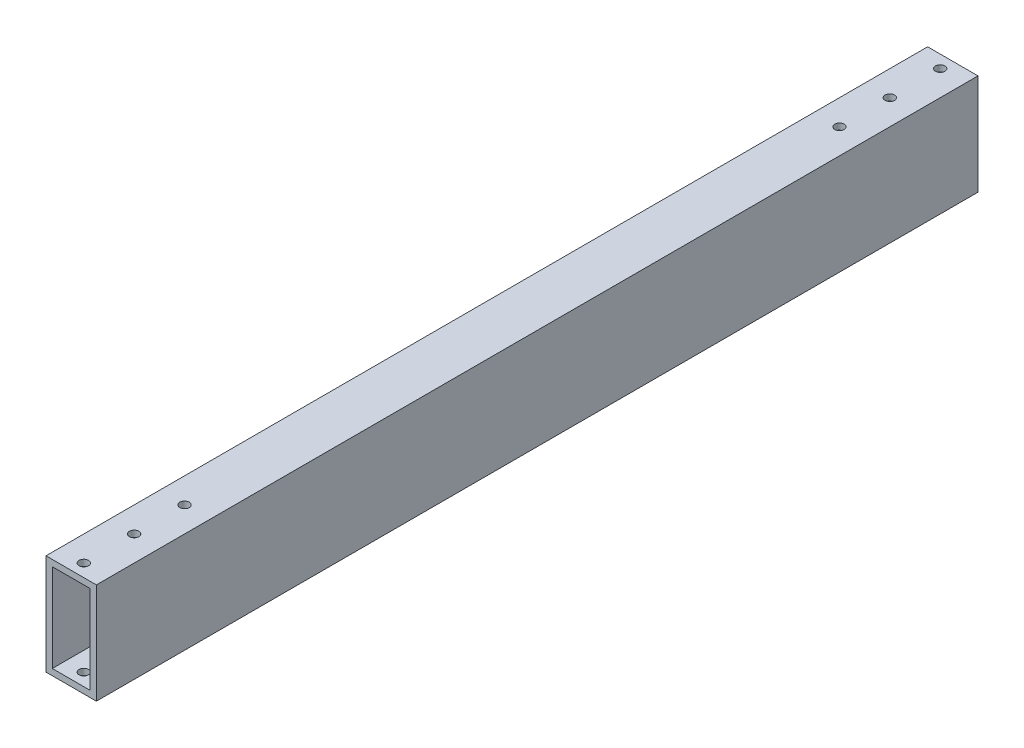
ISO-10303-21;
HEADER;
FILE_DESCRIPTION(('STEP AP214'),'2;1');
FILE_NAME('part.step','',(''),(''),'','','');
FILE_SCHEMA(('AUTOMOTIVE_DESIGN { 1 0 10303 214 1 1 1 1 }'));
ENDSEC;
DATA;
#1=APPLICATION_CONTEXT('core data for automotive mechanical design processes');
#2=APPLICATION_PROTOCOL_DEFINITION('international standard','automotive_design',2000,#1);
#3=PRODUCT_CONTEXT('',#1,'mechanical');
#4=PRODUCT('Part','Part','',(#3));
#5=PRODUCT_RELATED_PRODUCT_CATEGORY('part','',(#4));
#6=PRODUCT_DEFINITION_FORMATION('','',#4);
#7=PRODUCT_DEFINITION_CONTEXT('part definition',#1,'design');
#8=PRODUCT_DEFINITION('design','',#6,#7);
#9=PRODUCT_DEFINITION_SHAPE('','',#8);
#10=(LENGTH_UNIT() NAMED_UNIT(*) SI_UNIT(.MILLI.,.METRE.));
#11=(NAMED_UNIT(*) PLANE_ANGLE_UNIT() SI_UNIT($,.RADIAN.));
#12=(NAMED_UNIT(*) SI_UNIT($,.STERADIAN.) SOLID_ANGLE_UNIT());
#13=UNCERTAINTY_MEASURE_WITH_UNIT(LENGTH_MEASURE(1.E-05),#10,'distance_accuracy_value','');
#14=(GEOMETRIC_REPRESENTATION_CONTEXT(3) GLOBAL_UNCERTAINTY_ASSIGNED_CONTEXT((#13)) GLOBAL_UNIT_ASSIGNED_CONTEXT((#10,
#11,#12)) REPRESENTATION_CONTEXT('',''));
#15=CARTESIAN_POINT('',(0.,0.,0.));
#16=DIRECTION('',(0.,0.,1.));
#17=DIRECTION('',(1.,0.,0.));
#18=AXIS2_PLACEMENT_3D('',#15,#16,#17);
#19=CARTESIAN_POINT('',(12.7,25.4000000000001,444.5));
#20=DIRECTION('',(-1.,0.,0.));
#21=DIRECTION('',(0.,-1.,0.));
#22=AXIS2_PLACEMENT_3D('',#19,#20,#21);
#23=PLANE('',#22);
#24=DIRECTION('',(0.,1.,0.));
#25=VECTOR('',#24,1.);
#26=CARTESIAN_POINT('',(12.7,25.4000000000001,0.));
#27=LINE('',#26,#25);
#28=CARTESIAN_POINT('',(12.7,-25.3999999999999,0.));
#29=VERTEX_POINT('',#28);
#30=CARTESIAN_POINT('',(12.7,25.4000000000001,0.));
#31=VERTEX_POINT('',#30);
#32=EDGE_CURVE('E148',#29,#31,#27,.T.);
#33=ORIENTED_EDGE('',*,*,#32,.T.);
#34=DIRECTION('',(0.,0.,-1.));
#35=VECTOR('',#34,1.);
#36=CARTESIAN_POINT('',(12.7,25.4000000000001,444.5));
#37=LINE('',#36,#35);
#38=CARTESIAN_POINT('',(12.7,25.4000000000001,444.5));
#39=VERTEX_POINT('',#38);
#40=EDGE_CURVE('E11',#39,#31,#37,.T.);
#41=ORIENTED_EDGE('',*,*,#40,.F.);
#42=DIRECTION('',(0.,1.,0.));
#43=VECTOR('',#42,1.);
#44=CARTESIAN_POINT('',(12.7,25.4000000000001,444.5));
#45=LINE('',#44,#43);
#46=CARTESIAN_POINT('',(12.7,-25.3999999999999,444.5));
#47=VERTEX_POINT('',#46);
#48=EDGE_CURVE('E137',#47,#39,#45,.T.);
#49=ORIENTED_EDGE('',*,*,#48,.F.);
#50=DIRECTION('',(0.,0.,-1.));
#51=VECTOR('',#50,1.);
#52=CARTESIAN_POINT('',(12.7,-25.3999999999999,444.5));
#53=LINE('',#52,#51);
#54=EDGE_CURVE('E147',#47,#29,#53,.T.);
#55=ORIENTED_EDGE('',*,*,#54,.T.);
#56=EDGE_LOOP('',(#33,#41,#49,#55));
#57=FACE_BOUND('',#56,.T.);
#58=ADVANCED_FACE('F37',(#57),#23,.F.);
#59=CARTESIAN_POINT('',(-12.7,25.4000000000001,444.5));
#60=DIRECTION('',(0.,-1.,0.));
#61=DIRECTION('',(0.,0.,-1.));
#62=AXIS2_PLACEMENT_3D('',#59,#60,#61);
#63=PLANE('',#62);
#64=CARTESIAN_POINT('',(0.,25.4000000000001,6.35));
#65=DIRECTION('',(0.,1.,0.));
#66=DIRECTION('',(0.,0.,1.));
#67=AXIS2_PLACEMENT_3D('',#64,#65,#66);
#68=CIRCLE('',#67,2.38125);
#69=CARTESIAN_POINT('',(0.,25.4000000000001,8.73125));
#70=VERTEX_POINT('',#69);
#71=EDGE_CURVE('E338',#70,#70,#68,.T.);
#72=ORIENTED_EDGE('',*,*,#71,.F.);
#73=EDGE_LOOP('',(#72));
#74=FACE_BOUND('',#73,.T.);
#75=CARTESIAN_POINT('',(0.,25.4000000000001,31.75));
#76=DIRECTION('',(0.,1.,0.));
#77=DIRECTION('',(0.,0.,1.));
#78=AXIS2_PLACEMENT_3D('',#75,#76,#77);
#79=CIRCLE('',#78,2.38125);
#80=CARTESIAN_POINT('',(0.,25.4000000000001,34.13125));
#81=VERTEX_POINT('',#80);
#82=EDGE_CURVE('E336',#81,#81,#79,.T.);
#83=ORIENTED_EDGE('',*,*,#82,.F.);
#84=EDGE_LOOP('',(#83));
#85=FACE_BOUND('',#84,.T.);
#86=CARTESIAN_POINT('',(0.,25.4000000000001,57.15));
#87=DIRECTION('',(0.,1.,0.));
#88=DIRECTION('',(0.,0.,1.));
#89=AXIS2_PLACEMENT_3D('',#86,#87,#88);
#90=CIRCLE('',#89,2.38125);
#91=CARTESIAN_POINT('',(0.,25.4000000000001,59.53125));
#92=VERTEX_POINT('',#91);
#93=EDGE_CURVE('E344',#92,#92,#90,.T.);
#94=ORIENTED_EDGE('',*,*,#93,.F.);
#95=EDGE_LOOP('',(#94));
#96=FACE_BOUND('',#95,.T.);
#97=CARTESIAN_POINT('',(0.,25.4000000000001,387.35));
#98=DIRECTION('',(0.,1.,0.));
#99=DIRECTION('',(0.,0.,-1.));
#100=AXIS2_PLACEMENT_3D('',#97,#98,#99);
#101=CIRCLE('',#100,2.38124999999998);
#102=CARTESIAN_POINT('',(0.,25.4000000000001,384.96875));
#103=VERTEX_POINT('',#102);
#104=EDGE_CURVE('E353',#103,#103,#101,.T.);
#105=ORIENTED_EDGE('',*,*,#104,.F.);
#106=EDGE_LOOP('',(#105));
#107=FACE_BOUND('',#106,.T.);
#108=CARTESIAN_POINT('',(0.,25.4000000000001,412.75));
#109=DIRECTION('',(0.,1.,0.));
#110=DIRECTION('',(0.,0.,-1.));
#111=AXIS2_PLACEMENT_3D('',#108,#109,#110);
#112=CIRCLE('',#111,2.38124999999998);
#113=CARTESIAN_POINT('',(0.,25.4000000000001,410.36875));
#114=VERTEX_POINT('',#113);
#115=EDGE_CURVE('E359',#114,#114,#112,.T.);
#116=ORIENTED_EDGE('',*,*,#115,.F.);
#117=EDGE_LOOP('',(#116));
#118=FACE_BOUND('',#117,.T.);
#119=CARTESIAN_POINT('',(0.,25.4000000000001,438.15));
#120=DIRECTION('',(0.,1.,0.));
#121=DIRECTION('',(0.,0.,-1.));
#122=AXIS2_PLACEMENT_3D('',#119,#120,#121);
#123=CIRCLE('',#122,2.38125000000002);
#124=CARTESIAN_POINT('',(0.,25.4000000000001,435.76875));
#125=VERTEX_POINT('',#124);
#126=EDGE_CURVE('E276',#125,#125,#123,.T.);
#127=ORIENTED_EDGE('',*,*,#126,.F.);
#128=EDGE_LOOP('',(#127));
#129=FACE_BOUND('',#128,.T.);
#130=DIRECTION('',(-1.,0.,0.));
#131=VECTOR('',#130,1.);
#132=CARTESIAN_POINT('',(-12.7,25.4000000000001,0.));
#133=LINE('',#132,#131);
#134=CARTESIAN_POINT('',(-12.7,25.4000000000001,0.));
#135=VERTEX_POINT('',#134);
#136=EDGE_CURVE('E151',#31,#135,#133,.T.);
#137=ORIENTED_EDGE('',*,*,#136,.T.);
#138=DIRECTION('',(0.,0.,-1.));
#139=VECTOR('',#138,1.);
#140=CARTESIAN_POINT('',(-12.7,25.4000000000001,444.5));
#141=LINE('',#140,#139);
#142=CARTESIAN_POINT('',(-12.7,25.4000000000001,444.5));
#143=VERTEX_POINT('',#142);
#144=EDGE_CURVE('E45',#143,#135,#141,.T.);
#145=ORIENTED_EDGE('',*,*,#144,.F.);
#146=DIRECTION('',(-1.,0.,0.));
#147=VECTOR('',#146,1.);
#148=CARTESIAN_POINT('',(-12.7,25.4000000000001,444.5));
#149=LINE('',#148,#147);
#150=EDGE_CURVE('E140',#39,#143,#149,.T.);
#151=ORIENTED_EDGE('',*,*,#150,.F.);
#152=ORIENTED_EDGE('',*,*,#40,.T.);
#153=EDGE_LOOP('',(#137,#145,#151,#152));
#154=FACE_BOUND('',#153,.T.);
#155=ADVANCED_FACE('F217',(#74,#85,#96,#107,#118,#129,#154),#63,.F.);
#156=CARTESIAN_POINT('',(-12.7,25.4000000000001,444.5));
#157=DIRECTION('',(1.,0.,0.));
#158=DIRECTION('',(0.,1.,0.));
#159=AXIS2_PLACEMENT_3D('',#156,#157,#158);
#160=PLANE('',#159);
#161=DIRECTION('',(0.,-1.,0.));
#162=VECTOR('',#161,1.);
#163=CARTESIAN_POINT('',(-12.7,25.4000000000001,0.));
#164=LINE('',#163,#162);
#165=CARTESIAN_POINT('',(-12.7,-25.3999999999999,0.));
#166=VERTEX_POINT('',#165);
#167=EDGE_CURVE('E153',#135,#166,#164,.T.);
#168=ORIENTED_EDGE('',*,*,#167,.T.);
#169=DIRECTION('',(0.,0.,-1.));
#170=VECTOR('',#169,1.);
#171=CARTESIAN_POINT('',(-12.7,-25.3999999999999,444.5));
#172=LINE('',#171,#170);
#173=CARTESIAN_POINT('',(-12.7,-25.3999999999999,444.5));
#174=VERTEX_POINT('',#173);
#175=EDGE_CURVE('E158',#174,#166,#172,.T.);
#176=ORIENTED_EDGE('',*,*,#175,.F.);
#177=DIRECTION('',(0.,-1.,0.));
#178=VECTOR('',#177,1.);
#179=CARTESIAN_POINT('',(-12.7,25.4000000000001,444.5));
#180=LINE('',#179,#178);
#181=EDGE_CURVE('E143',#143,#174,#180,.T.);
#182=ORIENTED_EDGE('',*,*,#181,.F.);
#183=ORIENTED_EDGE('',*,*,#144,.T.);
#184=EDGE_LOOP('',(#168,#176,#182,#183));
#185=FACE_BOUND('',#184,.T.);
#186=ADVANCED_FACE('F222',(#185),#160,.F.);
#187=CARTESIAN_POINT('',(-12.7,-25.3999999999999,444.5));
#188=DIRECTION('',(0.,1.,0.));
#189=DIRECTION('',(0.,0.,1.));
#190=AXIS2_PLACEMENT_3D('',#187,#188,#189);
#191=PLANE('',#190);
#192=CARTESIAN_POINT('',(0.,-25.3999999999999,6.35));
#193=DIRECTION('',(0.,1.,0.));
#194=DIRECTION('',(0.,0.,1.));
#195=AXIS2_PLACEMENT_3D('',#192,#193,#194);
#196=CIRCLE('',#195,2.38125);
#197=CARTESIAN_POINT('',(0.,-25.3999999999999,8.73125));
#198=VERTEX_POINT('',#197);
#199=EDGE_CURVE('E167',#198,#198,#196,.T.);
#200=ORIENTED_EDGE('',*,*,#199,.T.);
#201=EDGE_LOOP('',(#200));
#202=FACE_BOUND('',#201,.T.);
#203=CARTESIAN_POINT('',(0.,-25.3999999999999,31.75));
#204=DIRECTION('',(0.,1.,0.));
#205=DIRECTION('',(0.,0.,1.));
#206=AXIS2_PLACEMENT_3D('',#203,#204,#205);
#207=CIRCLE('',#206,2.38125);
#208=CARTESIAN_POINT('',(0.,-25.3999999999999,34.13125));
#209=VERTEX_POINT('',#208);
#210=EDGE_CURVE('E339',#209,#209,#207,.T.);
#211=ORIENTED_EDGE('',*,*,#210,.T.);
#212=EDGE_LOOP('',(#211));
#213=FACE_BOUND('',#212,.T.);
#214=CARTESIAN_POINT('',(0.,-25.3999999999999,57.15));
#215=DIRECTION('',(0.,1.,0.));
#216=DIRECTION('',(0.,0.,1.));
#217=AXIS2_PLACEMENT_3D('',#214,#215,#216);
#218=CIRCLE('',#217,2.38125);
#219=CARTESIAN_POINT('',(0.,-25.3999999999999,59.53125));
#220=VERTEX_POINT('',#219);
#221=EDGE_CURVE('E350',#220,#220,#218,.T.);
#222=ORIENTED_EDGE('',*,*,#221,.T.);
#223=EDGE_LOOP('',(#222));
#224=FACE_BOUND('',#223,.T.);
#225=CARTESIAN_POINT('',(0.,-25.3999999999999,387.35));
#226=DIRECTION('',(0.,1.,0.));
#227=DIRECTION('',(0.,0.,-1.));
#228=AXIS2_PLACEMENT_3D('',#225,#226,#227);
#229=CIRCLE('',#228,2.38124999999998);
#230=CARTESIAN_POINT('',(0.,-25.3999999999999,384.96875));
#231=VERTEX_POINT('',#230);
#232=EDGE_CURVE('E356',#231,#231,#229,.T.);
#233=ORIENTED_EDGE('',*,*,#232,.T.);
#234=EDGE_LOOP('',(#233));
#235=FACE_BOUND('',#234,.T.);
#236=CARTESIAN_POINT('',(0.,-25.3999999999999,412.75));
#237=DIRECTION('',(0.,1.,0.));
#238=DIRECTION('',(0.,0.,-1.));
#239=AXIS2_PLACEMENT_3D('',#236,#237,#238);
#240=CIRCLE('',#239,2.38124999999998);
#241=CARTESIAN_POINT('',(0.,-25.3999999999999,410.36875));
#242=VERTEX_POINT('',#241);
#243=EDGE_CURVE('E279',#242,#242,#240,.T.);
#244=ORIENTED_EDGE('',*,*,#243,.T.);
#245=EDGE_LOOP('',(#244));
#246=FACE_BOUND('',#245,.T.);
#247=CARTESIAN_POINT('',(0.,-25.3999999999999,438.15));
#248=DIRECTION('',(0.,1.,0.));
#249=DIRECTION('',(0.,0.,-1.));
#250=AXIS2_PLACEMENT_3D('',#247,#248,#249);
#251=CIRCLE('',#250,2.38125000000002);
#252=CARTESIAN_POINT('',(0.,-25.3999999999999,435.76875));
#253=VERTEX_POINT('',#252);
#254=EDGE_CURVE('E274',#253,#253,#251,.T.);
#255=ORIENTED_EDGE('',*,*,#254,.T.);
#256=EDGE_LOOP('',(#255));
#257=FACE_BOUND('',#256,.T.);
#258=DIRECTION('',(1.,0.,0.));
#259=VECTOR('',#258,1.);
#260=CARTESIAN_POINT('',(-12.7,-25.3999999999999,0.));
#261=LINE('',#260,#259);
#262=EDGE_CURVE('E141',#166,#29,#261,.T.);
#263=ORIENTED_EDGE('',*,*,#262,.T.);
#264=ORIENTED_EDGE('',*,*,#54,.F.);
#265=DIRECTION('',(1.,0.,0.));
#266=VECTOR('',#265,1.);
#267=CARTESIAN_POINT('',(-12.7,-25.3999999999999,444.5));
#268=LINE('',#267,#266);
#269=EDGE_CURVE('E145',#174,#47,#268,.T.);
#270=ORIENTED_EDGE('',*,*,#269,.F.);
#271=ORIENTED_EDGE('',*,*,#175,.T.);
#272=EDGE_LOOP('',(#263,#264,#270,#271));
#273=FACE_BOUND('',#272,.T.);
#274=ADVANCED_FACE('F236',(#202,#213,#224,#235,#246,#257,#273),#191,.F.);
#275=CARTESIAN_POINT('',(0.,0.,444.5));
#276=DIRECTION('',(0.,0.,1.));
#277=DIRECTION('',(1.,0.,0.));
#278=AXIS2_PLACEMENT_3D('',#275,#276,#277);
#279=PLANE('',#278);
#280=DIRECTION('',(0.,1.,0.));
#281=VECTOR('',#280,1.);
#282=CARTESIAN_POINT('',(9.52499999999998,25.4000000000001,444.5));
#283=LINE('',#282,#281);
#284=CARTESIAN_POINT('',(9.52499999999999,-22.2249999999999,444.5));
#285=VERTEX_POINT('',#284);
#286=CARTESIAN_POINT('',(9.52499999999998,22.2250000000001,444.5));
#287=VERTEX_POINT('',#286);
#288=EDGE_CURVE('E125',#285,#287,#283,.T.);
#289=ORIENTED_EDGE('',*,*,#288,.F.);
#290=DIRECTION('',(1.,0.,0.));
#291=VECTOR('',#290,1.);
#292=CARTESIAN_POINT('',(-12.7,-22.2249999999999,444.5));
#293=LINE('',#292,#291);
#294=CARTESIAN_POINT('',(-9.52500000000001,-22.2249999999999,444.5));
#295=VERTEX_POINT('',#294);
#296=EDGE_CURVE('E108',#295,#285,#293,.T.);
#297=ORIENTED_EDGE('',*,*,#296,.F.);
#298=DIRECTION('',(0.,-1.,0.));
#299=VECTOR('',#298,1.);
#300=CARTESIAN_POINT('',(-9.52500000000002,25.4000000000001,444.5));
#301=LINE('',#300,#299);
#302=CARTESIAN_POINT('',(-9.52500000000002,22.2250000000001,444.5));
#303=VERTEX_POINT('',#302);
#304=EDGE_CURVE('E134',#303,#295,#301,.T.);
#305=ORIENTED_EDGE('',*,*,#304,.F.);
#306=DIRECTION('',(-1.,0.,0.));
#307=VECTOR('',#306,1.);
#308=CARTESIAN_POINT('',(-12.7,22.2250000000001,444.5));
#309=LINE('',#308,#307);
#310=EDGE_CURVE('E127',#287,#303,#309,.T.);
#311=ORIENTED_EDGE('',*,*,#310,.F.);
#312=EDGE_LOOP('',(#289,#297,#305,#311));
#313=FACE_BOUND('',#312,.T.);
#314=ORIENTED_EDGE('',*,*,#48,.T.);
#315=ORIENTED_EDGE('',*,*,#150,.T.);
#316=ORIENTED_EDGE('',*,*,#181,.T.);
#317=ORIENTED_EDGE('',*,*,#269,.T.);
#318=EDGE_LOOP('',(#314,#315,#316,#317));
#319=FACE_BOUND('',#318,.T.);
#320=ADVANCED_FACE('F201',(#313,#319),#279,.T.);
#321=CARTESIAN_POINT('',(0.,0.,0.));
#322=DIRECTION('',(0.,0.,1.));
#323=DIRECTION('',(1.,0.,0.));
#324=AXIS2_PLACEMENT_3D('',#321,#322,#323);
#325=PLANE('',#324);
#326=DIRECTION('',(1.,0.,0.));
#327=VECTOR('',#326,1.);
#328=CARTESIAN_POINT('',(-12.7,-22.2249999999999,0.));
#329=LINE('',#328,#327);
#330=CARTESIAN_POINT('',(-9.52500000000001,-22.2249999999999,0.));
#331=VERTEX_POINT('',#330);
#332=CARTESIAN_POINT('',(9.52499999999999,-22.2249999999999,0.));
#333=VERTEX_POINT('',#332);
#334=EDGE_CURVE('E106',#331,#333,#329,.T.);
#335=ORIENTED_EDGE('',*,*,#334,.T.);
#336=DIRECTION('',(0.,1.,0.));
#337=VECTOR('',#336,1.);
#338=CARTESIAN_POINT('',(9.52499999999998,25.4000000000001,0.));
#339=LINE('',#338,#337);
#340=CARTESIAN_POINT('',(9.52499999999998,22.2250000000001,0.));
#341=VERTEX_POINT('',#340);
#342=EDGE_CURVE('E114',#333,#341,#339,.T.);
#343=ORIENTED_EDGE('',*,*,#342,.T.);
#344=DIRECTION('',(-1.,0.,0.));
#345=VECTOR('',#344,1.);
#346=CARTESIAN_POINT('',(-12.7,22.2250000000001,0.));
#347=LINE('',#346,#345);
#348=CARTESIAN_POINT('',(-9.52500000000002,22.2250000000001,0.));
#349=VERTEX_POINT('',#348);
#350=EDGE_CURVE('E120',#341,#349,#347,.T.);
#351=ORIENTED_EDGE('',*,*,#350,.T.);
#352=DIRECTION('',(0.,-1.,0.));
#353=VECTOR('',#352,1.);
#354=CARTESIAN_POINT('',(-9.52500000000002,25.4000000000001,0.));
#355=LINE('',#354,#353);
#356=EDGE_CURVE('E60',#349,#331,#355,.T.);
#357=ORIENTED_EDGE('',*,*,#356,.T.);
#358=EDGE_LOOP('',(#335,#343,#351,#357));
#359=FACE_BOUND('',#358,.T.);
#360=ORIENTED_EDGE('',*,*,#32,.F.);
#361=ORIENTED_EDGE('',*,*,#262,.F.);
#362=ORIENTED_EDGE('',*,*,#167,.F.);
#363=ORIENTED_EDGE('',*,*,#136,.F.);
#364=EDGE_LOOP('',(#360,#361,#362,#363));
#365=FACE_BOUND('',#364,.T.);
#366=ADVANCED_FACE('F123',(#359,#365),#325,.F.);
#367=CARTESIAN_POINT('',(9.52499999999998,25.4000000000001,444.5));
#368=DIRECTION('',(-1.,0.,0.));
#369=DIRECTION('',(0.,-1.,0.));
#370=AXIS2_PLACEMENT_3D('',#367,#368,#369);
#371=PLANE('',#370);
#372=ORIENTED_EDGE('',*,*,#342,.F.);
#373=DIRECTION('',(0.,0.,-1.));
#374=VECTOR('',#373,1.);
#375=CARTESIAN_POINT('',(9.52499999999999,-22.2249999999999,444.5));
#376=LINE('',#375,#374);
#377=EDGE_CURVE('E102',#285,#333,#376,.T.);
#378=ORIENTED_EDGE('',*,*,#377,.F.);
#379=ORIENTED_EDGE('',*,*,#288,.T.);
#380=DIRECTION('',(0.,0.,-1.));
#381=VECTOR('',#380,1.);
#382=CARTESIAN_POINT('',(9.52499999999998,22.2250000000001,444.5));
#383=LINE('',#382,#381);
#384=EDGE_CURVE('E117',#287,#341,#383,.T.);
#385=ORIENTED_EDGE('',*,*,#384,.T.);
#386=EDGE_LOOP('',(#372,#378,#379,#385));
#387=FACE_BOUND('',#386,.T.);
#388=ADVANCED_FACE('F115',(#387),#371,.T.);
#389=CARTESIAN_POINT('',(-12.7,22.2250000000001,444.5));
#390=DIRECTION('',(0.,-1.,0.));
#391=DIRECTION('',(0.,0.,-1.));
#392=AXIS2_PLACEMENT_3D('',#389,#390,#391);
#393=PLANE('',#392);
#394=CARTESIAN_POINT('',(0.,22.2250000000001,6.35));
#395=DIRECTION('',(0.,-1.,0.));
#396=DIRECTION('',(0.,0.,-1.));
#397=AXIS2_PLACEMENT_3D('',#394,#395,#396);
#398=CIRCLE('',#397,2.38125);
#399=CARTESIAN_POINT('',(0.,22.2250000000001,3.96875));
#400=VERTEX_POINT('',#399);
#401=EDGE_CURVE('E121',#400,#400,#398,.T.);
#402=ORIENTED_EDGE('',*,*,#401,.F.);
#403=EDGE_LOOP('',(#402));
#404=FACE_BOUND('',#403,.T.);
#405=CARTESIAN_POINT('',(0.,22.2250000000001,31.75));
#406=DIRECTION('',(0.,-1.,0.));
#407=DIRECTION('',(0.,0.,-1.));
#408=AXIS2_PLACEMENT_3D('',#405,#406,#407);
#409=CIRCLE('',#408,2.38125);
#410=CARTESIAN_POINT('',(0.,22.2250000000001,29.36875));
#411=VERTEX_POINT('',#410);
#412=EDGE_CURVE('E181',#411,#411,#409,.T.);
#413=ORIENTED_EDGE('',*,*,#412,.F.);
#414=EDGE_LOOP('',(#413));
#415=FACE_BOUND('',#414,.T.);
#416=CARTESIAN_POINT('',(0.,22.2250000000001,57.15));
#417=DIRECTION('',(0.,-1.,0.));
#418=DIRECTION('',(0.,0.,-1.));
#419=AXIS2_PLACEMENT_3D('',#416,#417,#418);
#420=CIRCLE('',#419,2.38125);
#421=CARTESIAN_POINT('',(0.,22.2250000000001,54.76875));
#422=VERTEX_POINT('',#421);
#423=EDGE_CURVE('E178',#422,#422,#420,.T.);
#424=ORIENTED_EDGE('',*,*,#423,.F.);
#425=EDGE_LOOP('',(#424));
#426=FACE_BOUND('',#425,.T.);
#427=CARTESIAN_POINT('',(0.,22.2250000000001,387.35));
#428=DIRECTION('',(0.,-1.,0.));
#429=DIRECTION('',(0.,0.,-1.));
#430=AXIS2_PLACEMENT_3D('',#427,#428,#429);
#431=CIRCLE('',#430,2.38124999999998);
#432=CARTESIAN_POINT('',(0.,22.2250000000001,384.96875));
#433=VERTEX_POINT('',#432);
#434=EDGE_CURVE('E175',#433,#433,#431,.T.);
#435=ORIENTED_EDGE('',*,*,#434,.F.);
#436=EDGE_LOOP('',(#435));
#437=FACE_BOUND('',#436,.T.);
#438=CARTESIAN_POINT('',(0.,22.2250000000001,412.75));
#439=DIRECTION('',(0.,-1.,0.));
#440=DIRECTION('',(0.,0.,-1.));
#441=AXIS2_PLACEMENT_3D('',#438,#439,#440);
#442=CIRCLE('',#441,2.38124999999998);
#443=CARTESIAN_POINT('',(0.,22.2250000000001,410.36875));
#444=VERTEX_POINT('',#443);
#445=EDGE_CURVE('E171',#444,#444,#442,.T.);
#446=ORIENTED_EDGE('',*,*,#445,.F.);
#447=EDGE_LOOP('',(#446));
#448=FACE_BOUND('',#447,.T.);
#449=CARTESIAN_POINT('',(0.,22.2250000000001,438.15));
#450=DIRECTION('',(0.,-1.,0.));
#451=DIRECTION('',(0.,0.,-1.));
#452=AXIS2_PLACEMENT_3D('',#449,#450,#451);
#453=CIRCLE('',#452,2.38125000000002);
#454=CARTESIAN_POINT('',(0.,22.2250000000001,435.76875));
#455=VERTEX_POINT('',#454);
#456=EDGE_CURVE('E166',#455,#455,#453,.T.);
#457=ORIENTED_EDGE('',*,*,#456,.F.);
#458=EDGE_LOOP('',(#457));
#459=FACE_BOUND('',#458,.T.);
#460=ORIENTED_EDGE('',*,*,#350,.F.);
#461=ORIENTED_EDGE('',*,*,#384,.F.);
#462=ORIENTED_EDGE('',*,*,#310,.T.);
#463=DIRECTION('',(0.,0.,-1.));
#464=VECTOR('',#463,1.);
#465=CARTESIAN_POINT('',(-9.52500000000002,22.2250000000001,444.5));
#466=LINE('',#465,#464);
#467=EDGE_CURVE('E195',#303,#349,#466,.T.);
#468=ORIENTED_EDGE('',*,*,#467,.T.);
#469=EDGE_LOOP('',(#460,#461,#462,#468));
#470=FACE_BOUND('',#469,.T.);
#471=ADVANCED_FACE('F204',(#404,#415,#426,#437,#448,#459,#470),#393,.T.);
#472=CARTESIAN_POINT('',(-9.52500000000002,25.4000000000001,444.5));
#473=DIRECTION('',(1.,0.,0.));
#474=DIRECTION('',(0.,1.,0.));
#475=AXIS2_PLACEMENT_3D('',#472,#473,#474);
#476=PLANE('',#475);
#477=ORIENTED_EDGE('',*,*,#356,.F.);
#478=ORIENTED_EDGE('',*,*,#467,.F.);
#479=ORIENTED_EDGE('',*,*,#304,.T.);
#480=DIRECTION('',(0.,0.,-1.));
#481=VECTOR('',#480,1.);
#482=CARTESIAN_POINT('',(-9.52500000000001,-22.2249999999999,444.5));
#483=LINE('',#482,#481);
#484=EDGE_CURVE('E53',#295,#331,#483,.T.);
#485=ORIENTED_EDGE('',*,*,#484,.T.);
#486=EDGE_LOOP('',(#477,#478,#479,#485));
#487=FACE_BOUND('',#486,.T.);
#488=ADVANCED_FACE('F197',(#487),#476,.T.);
#489=CARTESIAN_POINT('',(-12.7,-22.2249999999999,444.5));
#490=DIRECTION('',(0.,1.,0.));
#491=DIRECTION('',(0.,0.,1.));
#492=AXIS2_PLACEMENT_3D('',#489,#490,#491);
#493=PLANE('',#492);
#494=CARTESIAN_POINT('',(0.,-22.2249999999999,6.35));
#495=DIRECTION('',(0.,1.,0.));
#496=DIRECTION('',(0.,0.,1.));
#497=AXIS2_PLACEMENT_3D('',#494,#495,#496);
#498=CIRCLE('',#497,2.38125);
#499=CARTESIAN_POINT('',(0.,-22.2249999999999,8.73125));
#500=VERTEX_POINT('',#499);
#501=EDGE_CURVE('E40',#500,#500,#498,.T.);
#502=ORIENTED_EDGE('',*,*,#501,.F.);
#503=EDGE_LOOP('',(#502));
#504=FACE_BOUND('',#503,.T.);
#505=CARTESIAN_POINT('',(0.,-22.2249999999999,31.75));
#506=DIRECTION('',(0.,1.,0.));
#507=DIRECTION('',(0.,0.,1.));
#508=AXIS2_PLACEMENT_3D('',#505,#506,#507);
#509=CIRCLE('',#508,2.38125);
#510=CARTESIAN_POINT('',(0.,-22.2249999999999,34.13125));
#511=VERTEX_POINT('',#510);
#512=EDGE_CURVE('E179',#511,#511,#509,.T.);
#513=ORIENTED_EDGE('',*,*,#512,.F.);
#514=EDGE_LOOP('',(#513));
#515=FACE_BOUND('',#514,.T.);
#516=CARTESIAN_POINT('',(0.,-22.2249999999999,57.15));
#517=DIRECTION('',(0.,1.,0.));
#518=DIRECTION('',(0.,0.,1.));
#519=AXIS2_PLACEMENT_3D('',#516,#517,#518);
#520=CIRCLE('',#519,2.38125);
#521=CARTESIAN_POINT('',(0.,-22.2249999999999,59.53125));
#522=VERTEX_POINT('',#521);
#523=EDGE_CURVE('E176',#522,#522,#520,.T.);
#524=ORIENTED_EDGE('',*,*,#523,.F.);
#525=EDGE_LOOP('',(#524));
#526=FACE_BOUND('',#525,.T.);
#527=CARTESIAN_POINT('',(0.,-22.2249999999999,387.35));
#528=DIRECTION('',(0.,1.,0.));
#529=DIRECTION('',(0.,0.,1.));
#530=AXIS2_PLACEMENT_3D('',#527,#528,#529);
#531=CIRCLE('',#530,2.38124999999998);
#532=CARTESIAN_POINT('',(0.,-22.2249999999999,389.73125));
#533=VERTEX_POINT('',#532);
#534=EDGE_CURVE('E172',#533,#533,#531,.T.);
#535=ORIENTED_EDGE('',*,*,#534,.F.);
#536=EDGE_LOOP('',(#535));
#537=FACE_BOUND('',#536,.T.);
#538=CARTESIAN_POINT('',(0.,-22.2249999999999,412.75));
#539=DIRECTION('',(0.,1.,0.));
#540=DIRECTION('',(0.,0.,1.));
#541=AXIS2_PLACEMENT_3D('',#538,#539,#540);
#542=CIRCLE('',#541,2.38124999999998);
#543=CARTESIAN_POINT('',(0.,-22.2249999999999,415.13125));
#544=VERTEX_POINT('',#543);
#545=EDGE_CURVE('E168',#544,#544,#542,.T.);
#546=ORIENTED_EDGE('',*,*,#545,.F.);
#547=EDGE_LOOP('',(#546));
#548=FACE_BOUND('',#547,.T.);
#549=CARTESIAN_POINT('',(0.,-22.2249999999999,438.15));
#550=DIRECTION('',(0.,1.,0.));
#551=DIRECTION('',(0.,0.,1.));
#552=AXIS2_PLACEMENT_3D('',#549,#550,#551);
#553=CIRCLE('',#552,2.38125000000002);
#554=CARTESIAN_POINT('',(0.,-22.2249999999999,440.53125));
#555=VERTEX_POINT('',#554);
#556=EDGE_CURVE('E163',#555,#555,#553,.T.);
#557=ORIENTED_EDGE('',*,*,#556,.F.);
#558=EDGE_LOOP('',(#557));
#559=FACE_BOUND('',#558,.T.);
#560=ORIENTED_EDGE('',*,*,#334,.F.);
#561=ORIENTED_EDGE('',*,*,#484,.F.);
#562=ORIENTED_EDGE('',*,*,#296,.T.);
#563=ORIENTED_EDGE('',*,*,#377,.T.);
#564=EDGE_LOOP('',(#560,#561,#562,#563));
#565=FACE_BOUND('',#564,.T.);
#566=ADVANCED_FACE('F104',(#504,#515,#526,#537,#548,#559,#565),#493,.T.);
#567=CARTESIAN_POINT('',(0.,-25.3999999999999,438.15));
#568=DIRECTION('',(0.,1.,0.));
#569=DIRECTION('',(0.,0.,1.));
#570=AXIS2_PLACEMENT_3D('',#567,#568,#569);
#571=CYLINDRICAL_SURFACE('',#570,2.38125000000002);
#572=ORIENTED_EDGE('',*,*,#556,.T.);
#573=EDGE_LOOP('',(#572));
#574=FACE_BOUND('',#573,.T.);
#575=ORIENTED_EDGE('',*,*,#254,.F.);
#576=EDGE_LOOP('',(#575));
#577=FACE_BOUND('',#576,.T.);
#578=ADVANCED_FACE('F251',(#574,#577),#571,.F.);
#579=CARTESIAN_POINT('',(0.,-25.3999999999999,412.75));
#580=DIRECTION('',(0.,1.,0.));
#581=DIRECTION('',(0.,0.,1.));
#582=AXIS2_PLACEMENT_3D('',#579,#580,#581);
#583=CYLINDRICAL_SURFACE('',#582,2.38124999999998);
#584=ORIENTED_EDGE('',*,*,#545,.T.);
#585=EDGE_LOOP('',(#584));
#586=FACE_BOUND('',#585,.T.);
#587=ORIENTED_EDGE('',*,*,#243,.F.);
#588=EDGE_LOOP('',(#587));
#589=FACE_BOUND('',#588,.T.);
#590=ADVANCED_FACE('F256',(#586,#589),#583,.F.);
#591=CARTESIAN_POINT('',(0.,-25.3999999999999,387.35));
#592=DIRECTION('',(0.,1.,0.));
#593=DIRECTION('',(0.,0.,1.));
#594=AXIS2_PLACEMENT_3D('',#591,#592,#593);
#595=CYLINDRICAL_SURFACE('',#594,2.38124999999998);
#596=ORIENTED_EDGE('',*,*,#534,.T.);
#597=EDGE_LOOP('',(#596));
#598=FACE_BOUND('',#597,.T.);
#599=ORIENTED_EDGE('',*,*,#232,.F.);
#600=EDGE_LOOP('',(#599));
#601=FACE_BOUND('',#600,.T.);
#602=ADVANCED_FACE('F310',(#598,#601),#595,.F.);
#603=CARTESIAN_POINT('',(0.,-25.3999999999999,57.15));
#604=DIRECTION('',(0.,1.,0.));
#605=DIRECTION('',(0.,0.,1.));
#606=AXIS2_PLACEMENT_3D('',#603,#604,#605);
#607=CYLINDRICAL_SURFACE('',#606,2.38125);
#608=ORIENTED_EDGE('',*,*,#523,.T.);
#609=EDGE_LOOP('',(#608));
#610=FACE_BOUND('',#609,.T.);
#611=ORIENTED_EDGE('',*,*,#221,.F.);
#612=EDGE_LOOP('',(#611));
#613=FACE_BOUND('',#612,.T.);
#614=ADVANCED_FACE('F314',(#610,#613),#607,.F.);
#615=CARTESIAN_POINT('',(0.,-25.3999999999999,31.75));
#616=DIRECTION('',(0.,1.,0.));
#617=DIRECTION('',(0.,0.,1.));
#618=AXIS2_PLACEMENT_3D('',#615,#616,#617);
#619=CYLINDRICAL_SURFACE('',#618,2.38125);
#620=ORIENTED_EDGE('',*,*,#512,.T.);
#621=EDGE_LOOP('',(#620));
#622=FACE_BOUND('',#621,.T.);
#623=ORIENTED_EDGE('',*,*,#210,.F.);
#624=EDGE_LOOP('',(#623));
#625=FACE_BOUND('',#624,.T.);
#626=ADVANCED_FACE('F304',(#622,#625),#619,.F.);
#627=CARTESIAN_POINT('',(0.,-25.3999999999999,6.35));
#628=DIRECTION('',(0.,1.,0.));
#629=DIRECTION('',(0.,0.,1.));
#630=AXIS2_PLACEMENT_3D('',#627,#628,#629);
#631=CYLINDRICAL_SURFACE('',#630,2.38125);
#632=ORIENTED_EDGE('',*,*,#501,.T.);
#633=EDGE_LOOP('',(#632));
#634=FACE_BOUND('',#633,.T.);
#635=ORIENTED_EDGE('',*,*,#199,.F.);
#636=EDGE_LOOP('',(#635));
#637=FACE_BOUND('',#636,.T.);
#638=ADVANCED_FACE('F295',(#634,#637),#631,.F.);
#639=ORIENTED_EDGE('',*,*,#456,.T.);
#640=EDGE_LOOP('',(#639));
#641=FACE_BOUND('',#640,.T.);
#642=ORIENTED_EDGE('',*,*,#126,.T.);
#643=EDGE_LOOP('',(#642));
#644=FACE_BOUND('',#643,.T.);
#645=ADVANCED_FACE('F259',(#641,#644),#571,.F.);
#646=ORIENTED_EDGE('',*,*,#445,.T.);
#647=EDGE_LOOP('',(#646));
#648=FACE_BOUND('',#647,.T.);
#649=ORIENTED_EDGE('',*,*,#115,.T.);
#650=EDGE_LOOP('',(#649));
#651=FACE_BOUND('',#650,.T.);
#652=ADVANCED_FACE('F287',(#648,#651),#583,.F.);
#653=ORIENTED_EDGE('',*,*,#434,.T.);
#654=EDGE_LOOP('',(#653));
#655=FACE_BOUND('',#654,.T.);
#656=ORIENTED_EDGE('',*,*,#104,.T.);
#657=EDGE_LOOP('',(#656));
#658=FACE_BOUND('',#657,.T.);
#659=ADVANCED_FACE('F302',(#655,#658),#595,.F.);
#660=ORIENTED_EDGE('',*,*,#423,.T.);
#661=EDGE_LOOP('',(#660));
#662=FACE_BOUND('',#661,.T.);
#663=ORIENTED_EDGE('',*,*,#93,.T.);
#664=EDGE_LOOP('',(#663));
#665=FACE_BOUND('',#664,.T.);
#666=ADVANCED_FACE('F319',(#662,#665),#607,.F.);
#667=ORIENTED_EDGE('',*,*,#412,.T.);
#668=EDGE_LOOP('',(#667));
#669=FACE_BOUND('',#668,.T.);
#670=ORIENTED_EDGE('',*,*,#82,.T.);
#671=EDGE_LOOP('',(#670));
#672=FACE_BOUND('',#671,.T.);
#673=ADVANCED_FACE('F321',(#669,#672),#619,.F.);
#674=ORIENTED_EDGE('',*,*,#401,.T.);
#675=EDGE_LOOP('',(#674));
#676=FACE_BOUND('',#675,.T.);
#677=ORIENTED_EDGE('',*,*,#71,.T.);
#678=EDGE_LOOP('',(#677));
#679=FACE_BOUND('',#678,.T.);
#680=ADVANCED_FACE('F307',(#676,#679),#631,.F.);
#681=CLOSED_SHELL('',(#58,#155,#186,#274,#320,#366,#388,#471,#488,#566,#578,#590,#602,#614,#626,
#638,#645,#652,#659,#666,#673,#680));
#682=MANIFOLD_SOLID_BREP('B2',#681);
#683=ADVANCED_BREP_SHAPE_REPRESENTATION('',(#18,#682),#14);
#684=SHAPE_DEFINITION_REPRESENTATION(#9,#683);
ENDSEC;
END-ISO-10303-21;
